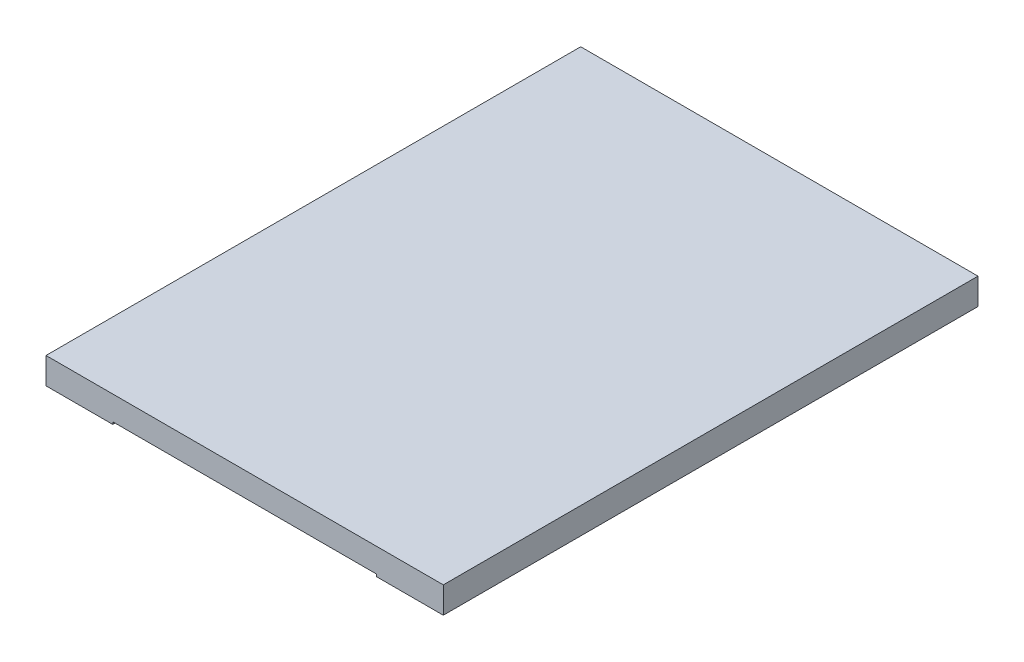
ISO-10303-21;
HEADER;
FILE_DESCRIPTION(('STEP AP214'),'2;1');
FILE_NAME('part.step','',(''),(''),'','','');
FILE_SCHEMA(('AUTOMOTIVE_DESIGN { 1 0 10303 214 1 1 1 1 }'));
ENDSEC;
DATA;
#1=APPLICATION_CONTEXT('core data for automotive mechanical design processes');
#2=APPLICATION_PROTOCOL_DEFINITION('international standard','automotive_design',2000,#1);
#3=PRODUCT_CONTEXT('',#1,'mechanical');
#4=PRODUCT('Part','Part','',(#3));
#5=PRODUCT_RELATED_PRODUCT_CATEGORY('part','',(#4));
#6=PRODUCT_DEFINITION_FORMATION('','',#4);
#7=PRODUCT_DEFINITION_CONTEXT('part definition',#1,'design');
#8=PRODUCT_DEFINITION('design','',#6,#7);
#9=PRODUCT_DEFINITION_SHAPE('','',#8);
#10=(LENGTH_UNIT() NAMED_UNIT(*) SI_UNIT(.MILLI.,.METRE.));
#11=(NAMED_UNIT(*) PLANE_ANGLE_UNIT() SI_UNIT($,.RADIAN.));
#12=(NAMED_UNIT(*) SI_UNIT($,.STERADIAN.) SOLID_ANGLE_UNIT());
#13=UNCERTAINTY_MEASURE_WITH_UNIT(LENGTH_MEASURE(1.E-05),#10,'distance_accuracy_value','');
#14=(GEOMETRIC_REPRESENTATION_CONTEXT(3) GLOBAL_UNCERTAINTY_ASSIGNED_CONTEXT((#13)) GLOBAL_UNIT_ASSIGNED_CONTEXT((#10,
#11,#12)) REPRESENTATION_CONTEXT('',''));
#15=CARTESIAN_POINT('',(0.,0.,0.));
#16=DIRECTION('',(0.,0.,1.));
#17=DIRECTION('',(1.,0.,0.));
#18=AXIS2_PLACEMENT_3D('',#15,#16,#17);
#19=CARTESIAN_POINT('',(17.35,2.3,23.35));
#20=DIRECTION('',(-1.,0.,0.));
#21=DIRECTION('',(0.,0.,1.));
#22=AXIS2_PLACEMENT_3D('',#19,#20,#21);
#23=PLANE('',#22);
#24=DIRECTION('',(0.,0.,-1.));
#25=VECTOR('',#24,1.);
#26=CARTESIAN_POINT('',(17.35,0.,23.35));
#27=LINE('',#26,#25);
#28=CARTESIAN_POINT('',(17.35,0.,23.35));
#29=VERTEX_POINT('',#28);
#30=CARTESIAN_POINT('',(17.35,0.,-23.35));
#31=VERTEX_POINT('',#30);
#32=EDGE_CURVE('E275',#29,#31,#27,.T.);
#33=ORIENTED_EDGE('',*,*,#32,.T.);
#34=DIRECTION('',(0.,-1.,0.));
#35=VECTOR('',#34,1.);
#36=CARTESIAN_POINT('',(17.35,2.3,-23.35));
#37=LINE('',#36,#35);
#38=CARTESIAN_POINT('',(17.35,2.3,-23.35));
#39=VERTEX_POINT('',#38);
#40=EDGE_CURVE('E11',#39,#31,#37,.T.);
#41=ORIENTED_EDGE('',*,*,#40,.F.);
#42=DIRECTION('',(0.,0.,-1.));
#43=VECTOR('',#42,1.);
#44=CARTESIAN_POINT('',(17.35,2.3,23.35));
#45=LINE('',#44,#43);
#46=CARTESIAN_POINT('',(17.35,2.3,23.35));
#47=VERTEX_POINT('',#46);
#48=EDGE_CURVE('E277',#47,#39,#45,.T.);
#49=ORIENTED_EDGE('',*,*,#48,.F.);
#50=DIRECTION('',(0.,-1.,0.));
#51=VECTOR('',#50,1.);
#52=CARTESIAN_POINT('',(17.35,2.3,23.35));
#53=LINE('',#52,#51);
#54=EDGE_CURVE('E287',#47,#29,#53,.T.);
#55=ORIENTED_EDGE('',*,*,#54,.T.);
#56=EDGE_LOOP('',(#33,#41,#49,#55));
#57=FACE_BOUND('',#56,.T.);
#58=ADVANCED_FACE('F37',(#57),#23,.F.);
#59=CARTESIAN_POINT('',(-17.35,2.3,-23.35));
#60=DIRECTION('',(0.,0.,1.));
#61=DIRECTION('',(1.,0.,0.));
#62=AXIS2_PLACEMENT_3D('',#59,#60,#61);
#63=PLANE('',#62);
#64=DIRECTION('',(-1.,0.,0.));
#65=VECTOR('',#64,1.);
#66=CARTESIAN_POINT('',(-17.35,0.,-23.35));
#67=LINE('',#66,#65);
#68=CARTESIAN_POINT('',(-17.35,0.,-23.35));
#69=VERTEX_POINT('',#68);
#70=EDGE_CURVE('E290',#31,#69,#67,.T.);
#71=ORIENTED_EDGE('',*,*,#70,.T.);
#72=DIRECTION('',(0.,-1.,0.));
#73=VECTOR('',#72,1.);
#74=CARTESIAN_POINT('',(-17.35,2.3,-23.35));
#75=LINE('',#74,#73);
#76=CARTESIAN_POINT('',(-17.35,2.3,-23.35));
#77=VERTEX_POINT('',#76);
#78=EDGE_CURVE('E44',#77,#69,#75,.T.);
#79=ORIENTED_EDGE('',*,*,#78,.F.);
#80=DIRECTION('',(-1.,0.,0.));
#81=VECTOR('',#80,1.);
#82=CARTESIAN_POINT('',(-17.35,2.3,-23.35));
#83=LINE('',#82,#81);
#84=EDGE_CURVE('E280',#39,#77,#83,.T.);
#85=ORIENTED_EDGE('',*,*,#84,.F.);
#86=ORIENTED_EDGE('',*,*,#40,.T.);
#87=EDGE_LOOP('',(#71,#79,#85,#86));
#88=FACE_BOUND('',#87,.T.);
#89=ADVANCED_FACE('F320',(#88),#63,.F.);
#90=CARTESIAN_POINT('',(-17.35,2.3,23.35));
#91=DIRECTION('',(1.,0.,0.));
#92=DIRECTION('',(0.,0.,-1.));
#93=AXIS2_PLACEMENT_3D('',#90,#91,#92);
#94=PLANE('',#93);
#95=DIRECTION('',(0.,0.,1.));
#96=VECTOR('',#95,1.);
#97=CARTESIAN_POINT('',(-17.35,0.,23.35));
#98=LINE('',#97,#96);
#99=CARTESIAN_POINT('',(-17.35,0.,23.35));
#100=VERTEX_POINT('',#99);
#101=EDGE_CURVE('E292',#69,#100,#98,.T.);
#102=ORIENTED_EDGE('',*,*,#101,.T.);
#103=DIRECTION('',(0.,-1.,0.));
#104=VECTOR('',#103,1.);
#105=CARTESIAN_POINT('',(-17.35,2.3,23.35));
#106=LINE('',#105,#104);
#107=CARTESIAN_POINT('',(-17.35,2.3,23.35));
#108=VERTEX_POINT('',#107);
#109=EDGE_CURVE('E298',#108,#100,#106,.T.);
#110=ORIENTED_EDGE('',*,*,#109,.F.);
#111=DIRECTION('',(0.,0.,1.));
#112=VECTOR('',#111,1.);
#113=CARTESIAN_POINT('',(-17.35,2.3,23.35));
#114=LINE('',#113,#112);
#115=EDGE_CURVE('E283',#77,#108,#114,.T.);
#116=ORIENTED_EDGE('',*,*,#115,.F.);
#117=ORIENTED_EDGE('',*,*,#78,.T.);
#118=EDGE_LOOP('',(#102,#110,#116,#117));
#119=FACE_BOUND('',#118,.T.);
#120=ADVANCED_FACE('F305',(#119),#94,.F.);
#121=CARTESIAN_POINT('',(-17.35,2.3,23.35));
#122=DIRECTION('',(0.,0.,-1.));
#123=DIRECTION('',(-1.,0.,0.));
#124=AXIS2_PLACEMENT_3D('',#121,#122,#123);
#125=PLANE('',#124);
#126=DIRECTION('',(-1.,0.,0.));
#127=VECTOR('',#126,1.);
#128=CARTESIAN_POINT('',(11.515,0.2,23.35));
#129=LINE('',#128,#127);
#130=CARTESIAN_POINT('',(11.515,0.2,23.35));
#131=VERTEX_POINT('',#130);
#132=CARTESIAN_POINT('',(-11.515,0.2,23.35));
#133=VERTEX_POINT('',#132);
#134=EDGE_CURVE('E175',#131,#133,#129,.T.);
#135=ORIENTED_EDGE('',*,*,#134,.F.);
#136=DIRECTION('',(0.,-1.,0.));
#137=VECTOR('',#136,1.);
#138=CARTESIAN_POINT('',(11.515,0.2,23.35));
#139=LINE('',#138,#137);
#140=CARTESIAN_POINT('',(11.515,0.,23.35));
#141=VERTEX_POINT('',#140);
#142=EDGE_CURVE('E162',#131,#141,#139,.T.);
#143=ORIENTED_EDGE('',*,*,#142,.T.);
#144=DIRECTION('',(1.,0.,0.));
#145=VECTOR('',#144,1.);
#146=CARTESIAN_POINT('',(-17.35,0.,23.35));
#147=LINE('',#146,#145);
#148=EDGE_CURVE('E294',#141,#29,#147,.T.);
#149=ORIENTED_EDGE('',*,*,#148,.T.);
#150=ORIENTED_EDGE('',*,*,#54,.F.);
#151=DIRECTION('',(1.,0.,0.));
#152=VECTOR('',#151,1.);
#153=CARTESIAN_POINT('',(-17.35,2.3,23.35));
#154=LINE('',#153,#152);
#155=EDGE_CURVE('E285',#108,#47,#154,.T.);
#156=ORIENTED_EDGE('',*,*,#155,.F.);
#157=ORIENTED_EDGE('',*,*,#109,.T.);
#158=CARTESIAN_POINT('',(-11.515,0.,23.35));
#159=VERTEX_POINT('',#158);
#160=EDGE_CURVE('E281',#100,#159,#147,.T.);
#161=ORIENTED_EDGE('',*,*,#160,.T.);
#162=DIRECTION('',(0.,-1.,0.));
#163=VECTOR('',#162,1.);
#164=CARTESIAN_POINT('',(-11.515,0.2,23.35));
#165=LINE('',#164,#163);
#166=EDGE_CURVE('E171',#133,#159,#165,.T.);
#167=ORIENTED_EDGE('',*,*,#166,.F.);
#168=EDGE_LOOP('',(#135,#143,#149,#150,#156,#157,#161,#167));
#169=FACE_BOUND('',#168,.T.);
#170=ADVANCED_FACE('F181',(#169),#125,.F.);
#171=CARTESIAN_POINT('',(0.,2.3,0.));
#172=DIRECTION('',(0.,-1.,0.));
#173=DIRECTION('',(0.,0.,-1.));
#174=AXIS2_PLACEMENT_3D('',#171,#172,#173);
#175=PLANE('',#174);
#176=ORIENTED_EDGE('',*,*,#48,.T.);
#177=ORIENTED_EDGE('',*,*,#84,.T.);
#178=ORIENTED_EDGE('',*,*,#115,.T.);
#179=ORIENTED_EDGE('',*,*,#155,.T.);
#180=EDGE_LOOP('',(#176,#177,#178,#179));
#181=FACE_BOUND('',#180,.T.);
#182=ADVANCED_FACE('F318',(#181),#175,.F.);
#183=CARTESIAN_POINT('',(0.,0.,0.));
#184=DIRECTION('',(0.,-1.,0.));
#185=DIRECTION('',(0.,0.,-1.));
#186=AXIS2_PLACEMENT_3D('',#183,#184,#185);
#187=PLANE('',#186);
#188=DIRECTION('',(0.,0.,1.));
#189=VECTOR('',#188,1.);
#190=CARTESIAN_POINT('',(11.515,0.,23.35));
#191=LINE('',#190,#189);
#192=CARTESIAN_POINT('',(11.515,0.,20.6571398331903));
#193=VERTEX_POINT('',#192);
#194=EDGE_CURVE('E167',#193,#141,#191,.T.);
#195=ORIENTED_EDGE('',*,*,#194,.F.);
#196=DIRECTION('',(-1.,0.,0.));
#197=VECTOR('',#196,1.);
#198=CARTESIAN_POINT('',(-15.915,0.,20.6571398331903));
#199=LINE('',#198,#197);
#200=CARTESIAN_POINT('',(15.915,0.,20.6571398331903));
#201=VERTEX_POINT('',#200);
#202=EDGE_CURVE('E200',#201,#193,#199,.T.);
#203=ORIENTED_EDGE('',*,*,#202,.F.);
#204=DIRECTION('',(0.,0.,1.));
#205=VECTOR('',#204,1.);
#206=CARTESIAN_POINT('',(15.915,0.,16.44));
#207=LINE('',#206,#205);
#208=CARTESIAN_POINT('',(15.915,0.,-21.94));
#209=VERTEX_POINT('',#208);
#210=EDGE_CURVE('E258',#209,#201,#207,.T.);
#211=ORIENTED_EDGE('',*,*,#210,.F.);
#212=DIRECTION('',(1.,0.,0.));
#213=VECTOR('',#212,1.);
#214=CARTESIAN_POINT('',(15.915,0.,-21.94));
#215=LINE('',#214,#213);
#216=CARTESIAN_POINT('',(-15.915,0.,-21.94));
#217=VERTEX_POINT('',#216);
#218=EDGE_CURVE('E269',#217,#209,#215,.T.);
#219=ORIENTED_EDGE('',*,*,#218,.F.);
#220=DIRECTION('',(0.,0.,-1.));
#221=VECTOR('',#220,1.);
#222=CARTESIAN_POINT('',(-15.915,0.,16.44));
#223=LINE('',#222,#221);
#224=CARTESIAN_POINT('',(-15.915,0.,20.6571398331903));
#225=VERTEX_POINT('',#224);
#226=EDGE_CURVE('E59',#225,#217,#223,.T.);
#227=ORIENTED_EDGE('',*,*,#226,.F.);
#228=CARTESIAN_POINT('',(-11.515,0.,20.6571398331903));
#229=VERTEX_POINT('',#228);
#230=EDGE_CURVE('E191',#229,#225,#199,.T.);
#231=ORIENTED_EDGE('',*,*,#230,.F.);
#232=DIRECTION('',(0.,0.,-1.));
#233=VECTOR('',#232,1.);
#234=CARTESIAN_POINT('',(-11.515,0.,20.6571398331903));
#235=LINE('',#234,#233);
#236=EDGE_CURVE('E179',#159,#229,#235,.T.);
#237=ORIENTED_EDGE('',*,*,#236,.F.);
#238=ORIENTED_EDGE('',*,*,#160,.F.);
#239=ORIENTED_EDGE('',*,*,#101,.F.);
#240=ORIENTED_EDGE('',*,*,#70,.F.);
#241=ORIENTED_EDGE('',*,*,#32,.F.);
#242=ORIENTED_EDGE('',*,*,#148,.F.);
#243=EDGE_LOOP('',(#195,#203,#211,#219,#227,#231,#237,#238,#239,#240,#241,#242));
#244=FACE_BOUND('',#243,.T.);
#245=ADVANCED_FACE('F310',(#244),#187,.T.);
#246=CARTESIAN_POINT('',(-15.915,0.2,16.44));
#247=DIRECTION('',(-1.,0.,0.));
#248=DIRECTION('',(0.,0.,1.));
#249=AXIS2_PLACEMENT_3D('',#246,#247,#248);
#250=PLANE('',#249);
#251=ORIENTED_EDGE('',*,*,#226,.T.);
#252=DIRECTION('',(0.,-1.,0.));
#253=VECTOR('',#252,1.);
#254=CARTESIAN_POINT('',(-15.915,0.2,-21.94));
#255=LINE('',#254,#253);
#256=CARTESIAN_POINT('',(-15.915,0.2,-21.94));
#257=VERTEX_POINT('',#256);
#258=EDGE_CURVE('E267',#257,#217,#255,.T.);
#259=ORIENTED_EDGE('',*,*,#258,.F.);
#260=DIRECTION('',(0.,0.,-1.));
#261=VECTOR('',#260,1.);
#262=CARTESIAN_POINT('',(-15.915,0.2,16.44));
#263=LINE('',#262,#261);
#264=CARTESIAN_POINT('',(-15.915,0.2,16.44));
#265=VERTEX_POINT('',#264);
#266=EDGE_CURVE('E254',#265,#257,#263,.T.);
#267=ORIENTED_EDGE('',*,*,#266,.F.);
#268=DIRECTION('',(0.,-1.,0.));
#269=VECTOR('',#268,1.);
#270=CARTESIAN_POINT('',(-15.915,0.5,16.44));
#271=LINE('',#270,#269);
#272=CARTESIAN_POINT('',(-15.915,0.5,16.44));
#273=VERTEX_POINT('',#272);
#274=EDGE_CURVE('E216',#273,#265,#271,.T.);
#275=ORIENTED_EDGE('',*,*,#274,.F.);
#276=DIRECTION('',(0.,0.,-1.));
#277=VECTOR('',#276,1.);
#278=CARTESIAN_POINT('',(-15.915,0.5,16.44));
#279=LINE('',#278,#277);
#280=CARTESIAN_POINT('',(-15.915,0.5,20.6571398331903));
#281=VERTEX_POINT('',#280);
#282=EDGE_CURVE('E203',#281,#273,#279,.T.);
#283=ORIENTED_EDGE('',*,*,#282,.F.);
#284=DIRECTION('',(0.,-1.,0.));
#285=VECTOR('',#284,1.);
#286=CARTESIAN_POINT('',(-15.915,0.5,20.6571398331903));
#287=LINE('',#286,#285);
#288=EDGE_CURVE('E218',#281,#225,#287,.T.);
#289=ORIENTED_EDGE('',*,*,#288,.T.);
#290=EDGE_LOOP('',(#251,#259,#267,#275,#283,#289));
#291=FACE_BOUND('',#290,.T.);
#292=ADVANCED_FACE('F336',(#291),#250,.F.);
#293=CARTESIAN_POINT('',(15.915,0.2,16.44));
#294=DIRECTION('',(1.,0.,0.));
#295=DIRECTION('',(0.,0.,-1.));
#296=AXIS2_PLACEMENT_3D('',#293,#294,#295);
#297=PLANE('',#296);
#298=ORIENTED_EDGE('',*,*,#210,.T.);
#299=DIRECTION('',(0.,-1.,0.));
#300=VECTOR('',#299,1.);
#301=CARTESIAN_POINT('',(15.915,0.5,20.6571398331903));
#302=LINE('',#301,#300);
#303=CARTESIAN_POINT('',(15.915,0.5,20.6571398331903));
#304=VERTEX_POINT('',#303);
#305=EDGE_CURVE('E209',#304,#201,#302,.T.);
#306=ORIENTED_EDGE('',*,*,#305,.F.);
#307=DIRECTION('',(0.,0.,1.));
#308=VECTOR('',#307,1.);
#309=CARTESIAN_POINT('',(15.915,0.5,20.6571398331903));
#310=LINE('',#309,#308);
#311=CARTESIAN_POINT('',(15.915,0.5,16.44));
#312=VERTEX_POINT('',#311);
#313=EDGE_CURVE('E196',#312,#304,#310,.T.);
#314=ORIENTED_EDGE('',*,*,#313,.F.);
#315=DIRECTION('',(0.,-1.,0.));
#316=VECTOR('',#315,1.);
#317=CARTESIAN_POINT('',(15.915,0.5,16.44));
#318=LINE('',#317,#316);
#319=CARTESIAN_POINT('',(15.915,0.2,16.44));
#320=VERTEX_POINT('',#319);
#321=EDGE_CURVE('E212',#312,#320,#318,.T.);
#322=ORIENTED_EDGE('',*,*,#321,.T.);
#323=DIRECTION('',(0.,0.,1.));
#324=VECTOR('',#323,1.);
#325=CARTESIAN_POINT('',(15.915,0.2,16.44));
#326=LINE('',#325,#324);
#327=CARTESIAN_POINT('',(15.915,0.2,-21.94));
#328=VERTEX_POINT('',#327);
#329=EDGE_CURVE('E261',#328,#320,#326,.T.);
#330=ORIENTED_EDGE('',*,*,#329,.F.);
#331=DIRECTION('',(0.,-1.,0.));
#332=VECTOR('',#331,1.);
#333=CARTESIAN_POINT('',(15.915,0.2,-21.94));
#334=LINE('',#333,#332);
#335=EDGE_CURVE('E273',#328,#209,#334,.T.);
#336=ORIENTED_EDGE('',*,*,#335,.T.);
#337=EDGE_LOOP('',(#298,#306,#314,#322,#330,#336));
#338=FACE_BOUND('',#337,.T.);
#339=ADVANCED_FACE('F329',(#338),#297,.F.);
#340=CARTESIAN_POINT('',(15.915,0.2,-21.94));
#341=DIRECTION('',(0.,0.,-1.));
#342=DIRECTION('',(-1.,0.,0.));
#343=AXIS2_PLACEMENT_3D('',#340,#341,#342);
#344=PLANE('',#343);
#345=ORIENTED_EDGE('',*,*,#218,.T.);
#346=ORIENTED_EDGE('',*,*,#335,.F.);
#347=DIRECTION('',(1.,0.,0.));
#348=VECTOR('',#347,1.);
#349=CARTESIAN_POINT('',(15.915,0.2,-21.94));
#350=LINE('',#349,#348);
#351=EDGE_CURVE('E257',#257,#328,#350,.T.);
#352=ORIENTED_EDGE('',*,*,#351,.F.);
#353=ORIENTED_EDGE('',*,*,#258,.T.);
#354=EDGE_LOOP('',(#345,#346,#352,#353));
#355=FACE_BOUND('',#354,.T.);
#356=ADVANCED_FACE('F333',(#355),#344,.F.);
#357=CARTESIAN_POINT('',(0.,0.2,0.));
#358=DIRECTION('',(0.,1.,0.));
#359=DIRECTION('',(0.,0.,1.));
#360=AXIS2_PLACEMENT_3D('',#357,#358,#359);
#361=PLANE('',#360);
#362=DIRECTION('',(0.,0.,-1.));
#363=VECTOR('',#362,1.);
#364=CARTESIAN_POINT('',(-14.015,0.2,14.77));
#365=LINE('',#364,#363);
#366=CARTESIAN_POINT('',(-14.015,0.2,14.77));
#367=VERTEX_POINT('',#366);
#368=CARTESIAN_POINT('',(-14.015,0.2,-20.27));
#369=VERTEX_POINT('',#368);
#370=EDGE_CURVE('E222',#367,#369,#365,.T.);
#371=ORIENTED_EDGE('',*,*,#370,.F.);
#372=DIRECTION('',(-1.,0.,0.));
#373=VECTOR('',#372,1.);
#374=CARTESIAN_POINT('',(14.015,0.2,14.77));
#375=LINE('',#374,#373);
#376=CARTESIAN_POINT('',(14.015,0.2,14.77));
#377=VERTEX_POINT('',#376);
#378=EDGE_CURVE('E232',#377,#367,#375,.T.);
#379=ORIENTED_EDGE('',*,*,#378,.F.);
#380=DIRECTION('',(0.,0.,1.));
#381=VECTOR('',#380,1.);
#382=CARTESIAN_POINT('',(14.015,0.2,14.77));
#383=LINE('',#382,#381);
#384=CARTESIAN_POINT('',(14.015,0.2,-20.27));
#385=VERTEX_POINT('',#384);
#386=EDGE_CURVE('E229',#385,#377,#383,.T.);
#387=ORIENTED_EDGE('',*,*,#386,.F.);
#388=DIRECTION('',(1.,0.,0.));
#389=VECTOR('',#388,1.);
#390=CARTESIAN_POINT('',(14.015,0.2,-20.27));
#391=LINE('',#390,#389);
#392=EDGE_CURVE('E225',#369,#385,#391,.T.);
#393=ORIENTED_EDGE('',*,*,#392,.F.);
#394=EDGE_LOOP('',(#371,#379,#387,#393));
#395=FACE_BOUND('',#394,.T.);
#396=ORIENTED_EDGE('',*,*,#266,.T.);
#397=ORIENTED_EDGE('',*,*,#351,.T.);
#398=ORIENTED_EDGE('',*,*,#329,.T.);
#399=DIRECTION('',(-1.,0.,0.));
#400=VECTOR('',#399,1.);
#401=CARTESIAN_POINT('',(15.915,0.2,16.44));
#402=LINE('',#401,#400);
#403=EDGE_CURVE('E264',#320,#265,#402,.T.);
#404=ORIENTED_EDGE('',*,*,#403,.T.);
#405=EDGE_LOOP('',(#396,#397,#398,#404));
#406=FACE_BOUND('',#405,.T.);
#407=ADVANCED_FACE('F339',(#395,#406),#361,.F.);
#408=CARTESIAN_POINT('',(-14.015,0.2,14.77));
#409=DIRECTION('',(-1.,0.,0.));
#410=DIRECTION('',(0.,0.,1.));
#411=AXIS2_PLACEMENT_3D('',#408,#409,#410);
#412=PLANE('',#411);
#413=DIRECTION('',(0.,0.,-1.));
#414=VECTOR('',#413,1.);
#415=CARTESIAN_POINT('',(-14.015,0.,14.77));
#416=LINE('',#415,#414);
#417=CARTESIAN_POINT('',(-14.015,0.,14.77));
#418=VERTEX_POINT('',#417);
#419=CARTESIAN_POINT('',(-14.015,0.,-20.27));
#420=VERTEX_POINT('',#419);
#421=EDGE_CURVE('E215',#418,#420,#416,.T.);
#422=ORIENTED_EDGE('',*,*,#421,.F.);
#423=DIRECTION('',(0.,-1.,0.));
#424=VECTOR('',#423,1.);
#425=CARTESIAN_POINT('',(-14.015,0.2,14.77));
#426=LINE('',#425,#424);
#427=EDGE_CURVE('E246',#367,#418,#426,.T.);
#428=ORIENTED_EDGE('',*,*,#427,.F.);
#429=ORIENTED_EDGE('',*,*,#370,.T.);
#430=DIRECTION('',(0.,-1.,0.));
#431=VECTOR('',#430,1.);
#432=CARTESIAN_POINT('',(-14.015,0.2,-20.27));
#433=LINE('',#432,#431);
#434=EDGE_CURVE('E235',#369,#420,#433,.T.);
#435=ORIENTED_EDGE('',*,*,#434,.T.);
#436=EDGE_LOOP('',(#422,#428,#429,#435));
#437=FACE_BOUND('',#436,.T.);
#438=ADVANCED_FACE('F379',(#437),#412,.T.);
#439=CARTESIAN_POINT('',(14.015,0.2,14.77));
#440=DIRECTION('',(0.,0.,1.));
#441=DIRECTION('',(1.,0.,0.));
#442=AXIS2_PLACEMENT_3D('',#439,#440,#441);
#443=PLANE('',#442);
#444=DIRECTION('',(-1.,0.,0.));
#445=VECTOR('',#444,1.);
#446=CARTESIAN_POINT('',(14.015,0.,14.77));
#447=LINE('',#446,#445);
#448=CARTESIAN_POINT('',(14.015,0.,14.77));
#449=VERTEX_POINT('',#448);
#450=EDGE_CURVE('E226',#449,#418,#447,.T.);
#451=ORIENTED_EDGE('',*,*,#450,.F.);
#452=DIRECTION('',(0.,-1.,0.));
#453=VECTOR('',#452,1.);
#454=CARTESIAN_POINT('',(14.015,0.2,14.77));
#455=LINE('',#454,#453);
#456=EDGE_CURVE('E248',#377,#449,#455,.T.);
#457=ORIENTED_EDGE('',*,*,#456,.F.);
#458=ORIENTED_EDGE('',*,*,#378,.T.);
#459=ORIENTED_EDGE('',*,*,#427,.T.);
#460=EDGE_LOOP('',(#451,#457,#458,#459));
#461=FACE_BOUND('',#460,.T.);
#462=ADVANCED_FACE('F383',(#461),#443,.T.);
#463=CARTESIAN_POINT('',(14.015,0.2,14.77));
#464=DIRECTION('',(1.,0.,0.));
#465=DIRECTION('',(0.,0.,-1.));
#466=AXIS2_PLACEMENT_3D('',#463,#464,#465);
#467=PLANE('',#466);
#468=DIRECTION('',(0.,0.,1.));
#469=VECTOR('',#468,1.);
#470=CARTESIAN_POINT('',(14.015,0.,14.77));
#471=LINE('',#470,#469);
#472=CARTESIAN_POINT('',(14.015,0.,-20.27));
#473=VERTEX_POINT('',#472);
#474=EDGE_CURVE('E241',#473,#449,#471,.T.);
#475=ORIENTED_EDGE('',*,*,#474,.F.);
#476=DIRECTION('',(0.,-1.,0.));
#477=VECTOR('',#476,1.);
#478=CARTESIAN_POINT('',(14.015,0.2,-20.27));
#479=LINE('',#478,#477);
#480=EDGE_CURVE('E250',#385,#473,#479,.T.);
#481=ORIENTED_EDGE('',*,*,#480,.F.);
#482=ORIENTED_EDGE('',*,*,#386,.T.);
#483=ORIENTED_EDGE('',*,*,#456,.T.);
#484=EDGE_LOOP('',(#475,#481,#482,#483));
#485=FACE_BOUND('',#484,.T.);
#486=ADVANCED_FACE('F388',(#485),#467,.T.);
#487=CARTESIAN_POINT('',(14.015,0.2,-20.27));
#488=DIRECTION('',(0.,0.,-1.));
#489=DIRECTION('',(-1.,0.,0.));
#490=AXIS2_PLACEMENT_3D('',#487,#488,#489);
#491=PLANE('',#490);
#492=DIRECTION('',(1.,0.,0.));
#493=VECTOR('',#492,1.);
#494=CARTESIAN_POINT('',(14.015,0.,-20.27));
#495=LINE('',#494,#493);
#496=EDGE_CURVE('E238',#420,#473,#495,.T.);
#497=ORIENTED_EDGE('',*,*,#496,.F.);
#498=ORIENTED_EDGE('',*,*,#434,.F.);
#499=ORIENTED_EDGE('',*,*,#392,.T.);
#500=ORIENTED_EDGE('',*,*,#480,.T.);
#501=EDGE_LOOP('',(#497,#498,#499,#500));
#502=FACE_BOUND('',#501,.T.);
#503=ADVANCED_FACE('F385',(#502),#491,.T.);
#504=ORIENTED_EDGE('',*,*,#450,.T.);
#505=ORIENTED_EDGE('',*,*,#421,.T.);
#506=ORIENTED_EDGE('',*,*,#496,.T.);
#507=ORIENTED_EDGE('',*,*,#474,.T.);
#508=EDGE_LOOP('',(#504,#505,#506,#507));
#509=FACE_BOUND('',#508,.T.);
#510=ADVANCED_FACE('F368',(#509),#187,.T.);
#511=CARTESIAN_POINT('',(15.915,0.5,16.44));
#512=DIRECTION('',(0.,0.,-1.));
#513=DIRECTION('',(-1.,0.,0.));
#514=AXIS2_PLACEMENT_3D('',#511,#512,#513);
#515=PLANE('',#514);
#516=ORIENTED_EDGE('',*,*,#321,.F.);
#517=DIRECTION('',(1.,0.,0.));
#518=VECTOR('',#517,1.);
#519=CARTESIAN_POINT('',(15.915,0.5,16.44));
#520=LINE('',#519,#518);
#521=EDGE_CURVE('E206',#273,#312,#520,.T.);
#522=ORIENTED_EDGE('',*,*,#521,.F.);
#523=ORIENTED_EDGE('',*,*,#274,.T.);
#524=ORIENTED_EDGE('',*,*,#403,.F.);
#525=EDGE_LOOP('',(#516,#522,#523,#524));
#526=FACE_BOUND('',#525,.T.);
#527=ADVANCED_FACE('F341',(#526),#515,.F.);
#528=CARTESIAN_POINT('',(-15.915,0.5,20.6571398331903));
#529=DIRECTION('',(0.,0.,1.));
#530=DIRECTION('',(1.,0.,0.));
#531=AXIS2_PLACEMENT_3D('',#528,#529,#530);
#532=PLANE('',#531);
#533=ORIENTED_EDGE('',*,*,#202,.T.);
#534=DIRECTION('',(0.,-1.,0.));
#535=VECTOR('',#534,1.);
#536=CARTESIAN_POINT('',(11.515,0.2,20.6571398331903));
#537=LINE('',#536,#535);
#538=CARTESIAN_POINT('',(11.515,0.2,20.6571398331903));
#539=VERTEX_POINT('',#538);
#540=EDGE_CURVE('E189',#539,#193,#537,.T.);
#541=ORIENTED_EDGE('',*,*,#540,.F.);
#542=DIRECTION('',(1.,0.,0.));
#543=VECTOR('',#542,1.);
#544=CARTESIAN_POINT('',(11.515,0.2,20.6571398331903));
#545=LINE('',#544,#543);
#546=CARTESIAN_POINT('',(-11.515,0.2,20.6571398331903));
#547=VERTEX_POINT('',#546);
#548=EDGE_CURVE('E172',#547,#539,#545,.T.);
#549=ORIENTED_EDGE('',*,*,#548,.F.);
#550=DIRECTION('',(0.,-1.,0.));
#551=VECTOR('',#550,1.);
#552=CARTESIAN_POINT('',(-11.515,0.2,20.6571398331903));
#553=LINE('',#552,#551);
#554=EDGE_CURVE('E192',#547,#229,#553,.T.);
#555=ORIENTED_EDGE('',*,*,#554,.T.);
#556=ORIENTED_EDGE('',*,*,#230,.T.);
#557=ORIENTED_EDGE('',*,*,#288,.F.);
#558=DIRECTION('',(-1.,0.,0.));
#559=VECTOR('',#558,1.);
#560=CARTESIAN_POINT('',(-15.915,0.5,20.6571398331903));
#561=LINE('',#560,#559);
#562=EDGE_CURVE('E199',#304,#281,#561,.T.);
#563=ORIENTED_EDGE('',*,*,#562,.F.);
#564=ORIENTED_EDGE('',*,*,#305,.T.);
#565=EDGE_LOOP('',(#533,#541,#549,#555,#556,#557,#563,#564));
#566=FACE_BOUND('',#565,.T.);
#567=ADVANCED_FACE('F325',(#566),#532,.F.);
#568=CARTESIAN_POINT('',(0.,0.5,0.));
#569=DIRECTION('',(0.,1.,0.));
#570=DIRECTION('',(0.,0.,1.));
#571=AXIS2_PLACEMENT_3D('',#568,#569,#570);
#572=PLANE('',#571);
#573=ORIENTED_EDGE('',*,*,#313,.T.);
#574=ORIENTED_EDGE('',*,*,#562,.T.);
#575=ORIENTED_EDGE('',*,*,#282,.T.);
#576=ORIENTED_EDGE('',*,*,#521,.T.);
#577=EDGE_LOOP('',(#573,#574,#575,#576));
#578=FACE_BOUND('',#577,.T.);
#579=ADVANCED_FACE('F344',(#578),#572,.F.);
#580=CARTESIAN_POINT('',(11.515,0.2,23.35));
#581=DIRECTION('',(1.,0.,0.));
#582=DIRECTION('',(0.,0.,-1.));
#583=AXIS2_PLACEMENT_3D('',#580,#581,#582);
#584=PLANE('',#583);
#585=ORIENTED_EDGE('',*,*,#194,.T.);
#586=ORIENTED_EDGE('',*,*,#142,.F.);
#587=DIRECTION('',(0.,0.,1.));
#588=VECTOR('',#587,1.);
#589=CARTESIAN_POINT('',(11.515,0.2,23.35));
#590=LINE('',#589,#588);
#591=EDGE_CURVE('E165',#539,#131,#590,.T.);
#592=ORIENTED_EDGE('',*,*,#591,.F.);
#593=ORIENTED_EDGE('',*,*,#540,.T.);
#594=EDGE_LOOP('',(#585,#586,#592,#593));
#595=FACE_BOUND('',#594,.T.);
#596=ADVANCED_FACE('F164',(#595),#584,.F.);
#597=CARTESIAN_POINT('',(-11.515,0.2,20.6571398331903));
#598=DIRECTION('',(-1.,0.,0.));
#599=DIRECTION('',(0.,0.,1.));
#600=AXIS2_PLACEMENT_3D('',#597,#598,#599);
#601=PLANE('',#600);
#602=ORIENTED_EDGE('',*,*,#236,.T.);
#603=ORIENTED_EDGE('',*,*,#554,.F.);
#604=DIRECTION('',(0.,0.,-1.));
#605=VECTOR('',#604,1.);
#606=CARTESIAN_POINT('',(-11.515,0.2,20.6571398331903));
#607=LINE('',#606,#605);
#608=EDGE_CURVE('E51',#133,#547,#607,.T.);
#609=ORIENTED_EDGE('',*,*,#608,.F.);
#610=ORIENTED_EDGE('',*,*,#166,.T.);
#611=EDGE_LOOP('',(#602,#603,#609,#610));
#612=FACE_BOUND('',#611,.T.);
#613=ADVANCED_FACE('F346',(#612),#601,.F.);
#614=CARTESIAN_POINT('',(0.,0.2,0.));
#615=DIRECTION('',(0.,1.,0.));
#616=DIRECTION('',(0.,0.,1.));
#617=AXIS2_PLACEMENT_3D('',#614,#615,#616);
#618=PLANE('',#617);
#619=ORIENTED_EDGE('',*,*,#591,.T.);
#620=ORIENTED_EDGE('',*,*,#134,.T.);
#621=ORIENTED_EDGE('',*,*,#608,.T.);
#622=ORIENTED_EDGE('',*,*,#548,.T.);
#623=EDGE_LOOP('',(#619,#620,#621,#622));
#624=FACE_BOUND('',#623,.T.);
#625=ADVANCED_FACE('F174',(#624),#618,.F.);
#626=CLOSED_SHELL('',(#58,#89,#120,#170,#182,#245,#292,#339,#356,#407,#438,#462,#486,#503,#510,
#527,#567,#579,#596,#613,#625));
#627=MANIFOLD_SOLID_BREP('B2',#626);
#628=ADVANCED_BREP_SHAPE_REPRESENTATION('',(#18,#627),#14);
#629=SHAPE_DEFINITION_REPRESENTATION(#9,#628);
ENDSEC;
END-ISO-10303-21;
